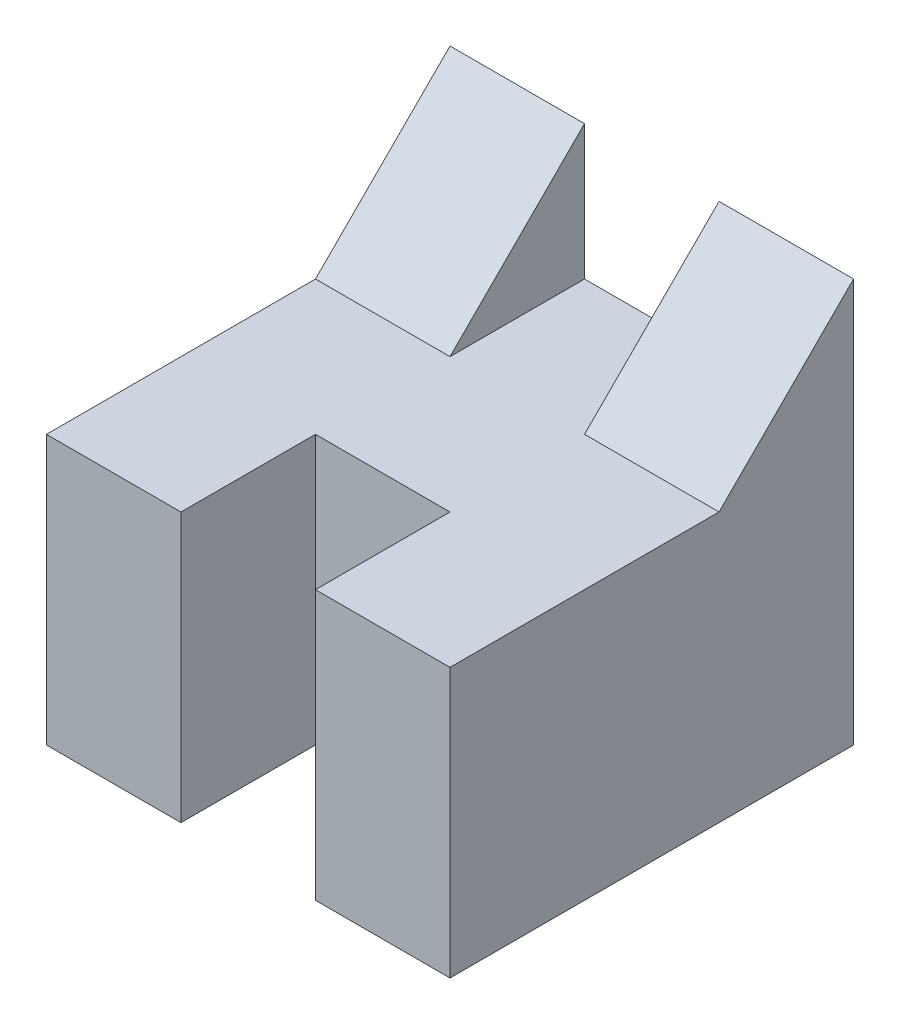
ISO-10303-21;
HEADER;
FILE_DESCRIPTION(('STEP AP214'),'2;1');
FILE_NAME('part.step','',(''),(''),'','','');
FILE_SCHEMA(('AUTOMOTIVE_DESIGN { 1 0 10303 214 1 1 1 1 }'));
ENDSEC;
DATA;
#1=APPLICATION_CONTEXT('core data for automotive mechanical design processes');
#2=APPLICATION_PROTOCOL_DEFINITION('international standard','automotive_design',2000,#1);
#3=PRODUCT_CONTEXT('',#1,'mechanical');
#4=PRODUCT('Part','Part','',(#3));
#5=PRODUCT_RELATED_PRODUCT_CATEGORY('part','',(#4));
#6=PRODUCT_DEFINITION_FORMATION('','',#4);
#7=PRODUCT_DEFINITION_CONTEXT('part definition',#1,'design');
#8=PRODUCT_DEFINITION('design','',#6,#7);
#9=PRODUCT_DEFINITION_SHAPE('','',#8);
#10=(LENGTH_UNIT() NAMED_UNIT(*) SI_UNIT(.MILLI.,.METRE.));
#11=(NAMED_UNIT(*) PLANE_ANGLE_UNIT() SI_UNIT($,.RADIAN.));
#12=(NAMED_UNIT(*) SI_UNIT($,.STERADIAN.) SOLID_ANGLE_UNIT());
#13=UNCERTAINTY_MEASURE_WITH_UNIT(LENGTH_MEASURE(1.E-05),#10,'distance_accuracy_value','');
#14=(GEOMETRIC_REPRESENTATION_CONTEXT(3) GLOBAL_UNCERTAINTY_ASSIGNED_CONTEXT((#13)) GLOBAL_UNIT_ASSIGNED_CONTEXT((#10,
#11,#12)) REPRESENTATION_CONTEXT('',''));
#15=CARTESIAN_POINT('',(0.,0.,0.));
#16=DIRECTION('',(0.,0.,1.));
#17=DIRECTION('',(1.,0.,0.));
#18=AXIS2_PLACEMENT_3D('',#15,#16,#17);
#19=CARTESIAN_POINT('',(0.,0.,0.));
#20=DIRECTION('',(0.,0.,-1.));
#21=DIRECTION('',(-1.,0.,0.));
#22=AXIS2_PLACEMENT_3D('',#19,#20,#21);
#23=PLANE('',#22);
#24=DIRECTION('',(1.,0.,0.));
#25=VECTOR('',#24,1.);
#26=CARTESIAN_POINT('',(0.,0.,0.));
#27=LINE('',#26,#25);
#28=CARTESIAN_POINT('',(0.,0.,0.));
#29=VERTEX_POINT('',#28);
#30=CARTESIAN_POINT('',(10.,0.,0.));
#31=VERTEX_POINT('',#30);
#32=EDGE_CURVE('E138',#29,#31,#27,.T.);
#33=ORIENTED_EDGE('',*,*,#32,.T.);
#34=DIRECTION('',(0.,1.,0.));
#35=VECTOR('',#34,1.);
#36=CARTESIAN_POINT('',(10.,0.,0.));
#37=LINE('',#36,#35);
#38=CARTESIAN_POINT('',(10.,20.,0.));
#39=VERTEX_POINT('',#38);
#40=EDGE_CURVE('E123',#31,#39,#37,.T.);
#41=ORIENTED_EDGE('',*,*,#40,.T.);
#42=DIRECTION('',(1.,0.,0.));
#43=VECTOR('',#42,1.);
#44=CARTESIAN_POINT('',(10.,20.,0.));
#45=LINE('',#44,#43);
#46=CARTESIAN_POINT('',(0.,20.,0.));
#47=VERTEX_POINT('',#46);
#48=EDGE_CURVE('E173',#47,#39,#45,.T.);
#49=ORIENTED_EDGE('',*,*,#48,.F.);
#50=DIRECTION('',(0.,-1.,0.));
#51=VECTOR('',#50,1.);
#52=CARTESIAN_POINT('',(0.,0.,0.));
#53=LINE('',#52,#51);
#54=EDGE_CURVE('E145',#47,#29,#53,.T.);
#55=ORIENTED_EDGE('',*,*,#54,.T.);
#56=EDGE_LOOP('',(#33,#41,#49,#55));
#57=FACE_BOUND('',#56,.T.);
#58=ADVANCED_FACE('F33',(#57),#23,.F.);
#59=CARTESIAN_POINT('',(0.,0.,-30.));
#60=DIRECTION('',(-1.,0.,0.));
#61=DIRECTION('',(0.,0.,1.));
#62=AXIS2_PLACEMENT_3D('',#59,#60,#61);
#63=PLANE('',#62);
#64=DIRECTION('',(0.,0.707106781186548,-0.707106781186548));
#65=VECTOR('',#64,1.);
#66=CARTESIAN_POINT('',(0.,0.,0.));
#67=LINE('',#66,#65);
#68=CARTESIAN_POINT('',(0.,20.,-20.));
#69=VERTEX_POINT('',#68);
#70=CARTESIAN_POINT('',(0.,30.,-30.));
#71=VERTEX_POINT('',#70);
#72=EDGE_CURVE('E198',#69,#71,#67,.T.);
#73=ORIENTED_EDGE('',*,*,#72,.T.);
#74=DIRECTION('',(0.,-1.,0.));
#75=VECTOR('',#74,1.);
#76=CARTESIAN_POINT('',(0.,0.,-30.));
#77=LINE('',#76,#75);
#78=CARTESIAN_POINT('',(0.,0.,-30.));
#79=VERTEX_POINT('',#78);
#80=EDGE_CURVE('E151',#71,#79,#77,.T.);
#81=ORIENTED_EDGE('',*,*,#80,.T.);
#82=DIRECTION('',(0.,0.,1.));
#83=VECTOR('',#82,1.);
#84=CARTESIAN_POINT('',(0.,0.,-30.));
#85=LINE('',#84,#83);
#86=EDGE_CURVE('E37',#79,#29,#85,.T.);
#87=ORIENTED_EDGE('',*,*,#86,.T.);
#88=ORIENTED_EDGE('',*,*,#54,.F.);
#89=DIRECTION('',(0.,0.,-1.));
#90=VECTOR('',#89,1.);
#91=CARTESIAN_POINT('',(0.,20.,0.));
#92=LINE('',#91,#90);
#93=EDGE_CURVE('E194',#47,#69,#92,.T.);
#94=ORIENTED_EDGE('',*,*,#93,.T.);
#95=EDGE_LOOP('',(#73,#81,#87,#88,#94));
#96=FACE_BOUND('',#95,.T.);
#97=ADVANCED_FACE('F35',(#96),#63,.T.);
#98=CARTESIAN_POINT('',(30.,0.,-30.));
#99=DIRECTION('',(1.,0.,0.));
#100=DIRECTION('',(0.,0.,-1.));
#101=AXIS2_PLACEMENT_3D('',#98,#99,#100);
#102=PLANE('',#101);
#103=DIRECTION('',(0.,0.707106781186548,-0.707106781186548));
#104=VECTOR('',#103,1.);
#105=CARTESIAN_POINT('',(30.,0.,0.));
#106=LINE('',#105,#104);
#107=CARTESIAN_POINT('',(30.,20.,-20.));
#108=VERTEX_POINT('',#107);
#109=CARTESIAN_POINT('',(30.,30.,-30.));
#110=VERTEX_POINT('',#109);
#111=EDGE_CURVE('E192',#108,#110,#106,.T.);
#112=ORIENTED_EDGE('',*,*,#111,.F.);
#113=DIRECTION('',(0.,0.,-1.));
#114=VECTOR('',#113,1.);
#115=CARTESIAN_POINT('',(30.,20.,0.));
#116=LINE('',#115,#114);
#117=CARTESIAN_POINT('',(30.,20.,0.));
#118=VERTEX_POINT('',#117);
#119=EDGE_CURVE('E195',#118,#108,#116,.T.);
#120=ORIENTED_EDGE('',*,*,#119,.F.);
#121=DIRECTION('',(0.,1.,0.));
#122=VECTOR('',#121,1.);
#123=CARTESIAN_POINT('',(30.,0.,0.));
#124=LINE('',#123,#122);
#125=CARTESIAN_POINT('',(30.,0.,0.));
#126=VERTEX_POINT('',#125);
#127=EDGE_CURVE('E147',#126,#118,#124,.T.);
#128=ORIENTED_EDGE('',*,*,#127,.F.);
#129=DIRECTION('',(0.,0.,1.));
#130=VECTOR('',#129,1.);
#131=CARTESIAN_POINT('',(30.,0.,-30.));
#132=LINE('',#131,#130);
#133=CARTESIAN_POINT('',(30.,0.,-30.));
#134=VERTEX_POINT('',#133);
#135=EDGE_CURVE('E11',#134,#126,#132,.T.);
#136=ORIENTED_EDGE('',*,*,#135,.F.);
#137=DIRECTION('',(0.,1.,0.));
#138=VECTOR('',#137,1.);
#139=CARTESIAN_POINT('',(30.,0.,-30.));
#140=LINE('',#139,#138);
#141=EDGE_CURVE('E159',#134,#110,#140,.T.);
#142=ORIENTED_EDGE('',*,*,#141,.T.);
#143=EDGE_LOOP('',(#112,#120,#128,#136,#142));
#144=FACE_BOUND('',#143,.T.);
#145=ADVANCED_FACE('F224',(#144),#102,.T.);
#146=CARTESIAN_POINT('',(0.,0.,-30.));
#147=DIRECTION('',(0.,-1.,0.));
#148=DIRECTION('',(0.,0.,-1.));
#149=AXIS2_PLACEMENT_3D('',#146,#147,#148);
#150=PLANE('',#149);
#151=DIRECTION('',(0.,0.,1.));
#152=VECTOR('',#151,1.);
#153=CARTESIAN_POINT('',(10.,0.,0.));
#154=LINE('',#153,#152);
#155=CARTESIAN_POINT('',(10.,0.,-10.));
#156=VERTEX_POINT('',#155);
#157=EDGE_CURVE('E126',#156,#31,#154,.T.);
#158=ORIENTED_EDGE('',*,*,#157,.T.);
#159=ORIENTED_EDGE('',*,*,#32,.F.);
#160=ORIENTED_EDGE('',*,*,#86,.F.);
#161=DIRECTION('',(1.,0.,0.));
#162=VECTOR('',#161,1.);
#163=CARTESIAN_POINT('',(0.,0.,-30.));
#164=LINE('',#163,#162);
#165=EDGE_CURVE('E162',#79,#134,#164,.T.);
#166=ORIENTED_EDGE('',*,*,#165,.T.);
#167=ORIENTED_EDGE('',*,*,#135,.T.);
#168=CARTESIAN_POINT('',(20.,0.,0.));
#169=VERTEX_POINT('',#168);
#170=EDGE_CURVE('E148',#169,#126,#27,.T.);
#171=ORIENTED_EDGE('',*,*,#170,.F.);
#172=DIRECTION('',(0.,0.,-1.));
#173=VECTOR('',#172,1.);
#174=CARTESIAN_POINT('',(20.,0.,0.));
#175=LINE('',#174,#173);
#176=CARTESIAN_POINT('',(20.,0.,-10.));
#177=VERTEX_POINT('',#176);
#178=EDGE_CURVE('E141',#169,#177,#175,.T.);
#179=ORIENTED_EDGE('',*,*,#178,.T.);
#180=DIRECTION('',(-1.,0.,0.));
#181=VECTOR('',#180,1.);
#182=CARTESIAN_POINT('',(10.,0.,-10.));
#183=LINE('',#182,#181);
#184=EDGE_CURVE('E133',#177,#156,#183,.T.);
#185=ORIENTED_EDGE('',*,*,#184,.T.);
#186=EDGE_LOOP('',(#158,#159,#160,#166,#167,#171,#179,#185));
#187=FACE_BOUND('',#186,.T.);
#188=ADVANCED_FACE('F137',(#187),#150,.T.);
#189=CARTESIAN_POINT('',(0.,0.,-30.));
#190=DIRECTION('',(0.,0.,-1.));
#191=DIRECTION('',(-1.,0.,0.));
#192=AXIS2_PLACEMENT_3D('',#189,#190,#191);
#193=PLANE('',#192);
#194=DIRECTION('',(0.,-1.,0.));
#195=VECTOR('',#194,1.);
#196=CARTESIAN_POINT('',(10.,30.,-30.));
#197=LINE('',#196,#195);
#198=CARTESIAN_POINT('',(10.,30.,-30.));
#199=VERTEX_POINT('',#198);
#200=CARTESIAN_POINT('',(10.,20.,-30.));
#201=VERTEX_POINT('',#200);
#202=EDGE_CURVE('E175',#199,#201,#197,.T.);
#203=ORIENTED_EDGE('',*,*,#202,.T.);
#204=DIRECTION('',(1.,0.,0.));
#205=VECTOR('',#204,1.);
#206=CARTESIAN_POINT('',(10.,20.,-30.));
#207=LINE('',#206,#205);
#208=CARTESIAN_POINT('',(20.,20.,-30.));
#209=VERTEX_POINT('',#208);
#210=EDGE_CURVE('E179',#201,#209,#207,.T.);
#211=ORIENTED_EDGE('',*,*,#210,.T.);
#212=DIRECTION('',(0.,1.,0.));
#213=VECTOR('',#212,1.);
#214=CARTESIAN_POINT('',(20.,30.,-30.));
#215=LINE('',#214,#213);
#216=CARTESIAN_POINT('',(20.,30.,-30.));
#217=VERTEX_POINT('',#216);
#218=EDGE_CURVE('E170',#209,#217,#215,.T.);
#219=ORIENTED_EDGE('',*,*,#218,.T.);
#220=DIRECTION('',(-1.,0.,0.));
#221=VECTOR('',#220,1.);
#222=CARTESIAN_POINT('',(0.,30.,-30.));
#223=LINE('',#222,#221);
#224=EDGE_CURVE('E156',#110,#217,#223,.T.);
#225=ORIENTED_EDGE('',*,*,#224,.F.);
#226=ORIENTED_EDGE('',*,*,#141,.F.);
#227=ORIENTED_EDGE('',*,*,#165,.F.);
#228=ORIENTED_EDGE('',*,*,#80,.F.);
#229=EDGE_CURVE('E158',#199,#71,#223,.T.);
#230=ORIENTED_EDGE('',*,*,#229,.F.);
#231=EDGE_LOOP('',(#203,#211,#219,#225,#226,#227,#228,#230));
#232=FACE_BOUND('',#231,.T.);
#233=ADVANCED_FACE('F236',(#232),#193,.T.);
#234=CARTESIAN_POINT('',(20.,20.,0.));
#235=VERTEX_POINT('',#234);
#236=EDGE_CURVE('E176',#235,#118,#45,.T.);
#237=ORIENTED_EDGE('',*,*,#236,.F.);
#238=DIRECTION('',(0.,1.,0.));
#239=VECTOR('',#238,1.);
#240=CARTESIAN_POINT('',(20.,0.,0.));
#241=LINE('',#240,#239);
#242=EDGE_CURVE('E48',#169,#235,#241,.T.);
#243=ORIENTED_EDGE('',*,*,#242,.F.);
#244=ORIENTED_EDGE('',*,*,#170,.T.);
#245=ORIENTED_EDGE('',*,*,#127,.T.);
#246=EDGE_LOOP('',(#237,#243,#244,#245));
#247=FACE_BOUND('',#246,.T.);
#248=ADVANCED_FACE('F217',(#247),#23,.F.);
#249=CARTESIAN_POINT('',(10.,30.,-30.));
#250=DIRECTION('',(-1.,0.,0.));
#251=DIRECTION('',(0.,-1.,0.));
#252=AXIS2_PLACEMENT_3D('',#249,#250,#251);
#253=PLANE('',#252);
#254=ORIENTED_EDGE('',*,*,#202,.F.);
#255=DIRECTION('',(0.,-0.707106781186548,0.707106781186548));
#256=VECTOR('',#255,1.);
#257=CARTESIAN_POINT('',(10.,30.,-30.));
#258=LINE('',#257,#256);
#259=CARTESIAN_POINT('',(10.,20.,-20.));
#260=VERTEX_POINT('',#259);
#261=EDGE_CURVE('E184',#199,#260,#258,.T.);
#262=ORIENTED_EDGE('',*,*,#261,.T.);
#263=DIRECTION('',(0.,0.,1.));
#264=VECTOR('',#263,1.);
#265=CARTESIAN_POINT('',(10.,20.,-30.));
#266=LINE('',#265,#264);
#267=EDGE_CURVE('E167',#201,#260,#266,.T.);
#268=ORIENTED_EDGE('',*,*,#267,.F.);
#269=EDGE_LOOP('',(#254,#262,#268));
#270=FACE_BOUND('',#269,.T.);
#271=ADVANCED_FACE('F239',(#270),#253,.F.);
#272=CARTESIAN_POINT('',(20.,30.,-30.));
#273=DIRECTION('',(1.,0.,0.));
#274=DIRECTION('',(0.,1.,0.));
#275=AXIS2_PLACEMENT_3D('',#272,#273,#274);
#276=PLANE('',#275);
#277=DIRECTION('',(0.,0.,1.));
#278=VECTOR('',#277,1.);
#279=CARTESIAN_POINT('',(20.,20.,-30.));
#280=LINE('',#279,#278);
#281=CARTESIAN_POINT('',(20.,20.,-20.));
#282=VERTEX_POINT('',#281);
#283=EDGE_CURVE('E155',#209,#282,#280,.T.);
#284=ORIENTED_EDGE('',*,*,#283,.T.);
#285=DIRECTION('',(0.,0.707106781186548,-0.707106781186548));
#286=VECTOR('',#285,1.);
#287=CARTESIAN_POINT('',(20.,30.,-30.));
#288=LINE('',#287,#286);
#289=EDGE_CURVE('E187',#282,#217,#288,.T.);
#290=ORIENTED_EDGE('',*,*,#289,.T.);
#291=ORIENTED_EDGE('',*,*,#218,.F.);
#292=EDGE_LOOP('',(#284,#290,#291));
#293=FACE_BOUND('',#292,.T.);
#294=ADVANCED_FACE('F231',(#293),#276,.F.);
#295=CARTESIAN_POINT('',(10.,20.,-30.));
#296=DIRECTION('',(0.,-1.,0.));
#297=DIRECTION('',(0.,0.,-1.));
#298=AXIS2_PLACEMENT_3D('',#295,#296,#297);
#299=PLANE('',#298);
#300=ORIENTED_EDGE('',*,*,#48,.T.);
#301=DIRECTION('',(0.,0.,1.));
#302=VECTOR('',#301,1.);
#303=CARTESIAN_POINT('',(10.,20.,0.));
#304=LINE('',#303,#302);
#305=CARTESIAN_POINT('',(10.,20.,-10.));
#306=VERTEX_POINT('',#305);
#307=EDGE_CURVE('E129',#306,#39,#304,.T.);
#308=ORIENTED_EDGE('',*,*,#307,.F.);
#309=DIRECTION('',(-1.,0.,0.));
#310=VECTOR('',#309,1.);
#311=CARTESIAN_POINT('',(10.,20.,-10.));
#312=LINE('',#311,#310);
#313=CARTESIAN_POINT('',(20.,20.,-10.));
#314=VERTEX_POINT('',#313);
#315=EDGE_CURVE('E142',#314,#306,#312,.T.);
#316=ORIENTED_EDGE('',*,*,#315,.F.);
#317=DIRECTION('',(0.,0.,-1.));
#318=VECTOR('',#317,1.);
#319=CARTESIAN_POINT('',(20.,20.,0.));
#320=LINE('',#319,#318);
#321=EDGE_CURVE('E209',#235,#314,#320,.T.);
#322=ORIENTED_EDGE('',*,*,#321,.F.);
#323=ORIENTED_EDGE('',*,*,#236,.T.);
#324=ORIENTED_EDGE('',*,*,#119,.T.);
#325=DIRECTION('',(1.,0.,0.));
#326=VECTOR('',#325,1.);
#327=CARTESIAN_POINT('',(0.,20.,-20.));
#328=LINE('',#327,#326);
#329=EDGE_CURVE('E56',#282,#108,#328,.T.);
#330=ORIENTED_EDGE('',*,*,#329,.F.);
#331=ORIENTED_EDGE('',*,*,#283,.F.);
#332=ORIENTED_EDGE('',*,*,#210,.F.);
#333=ORIENTED_EDGE('',*,*,#267,.T.);
#334=EDGE_CURVE('E190',#69,#260,#328,.T.);
#335=ORIENTED_EDGE('',*,*,#334,.F.);
#336=ORIENTED_EDGE('',*,*,#93,.F.);
#337=EDGE_LOOP('',(#300,#308,#316,#322,#323,#324,#330,#331,#332,#333,#335,#336));
#338=FACE_BOUND('',#337,.T.);
#339=ADVANCED_FACE('F220',(#338),#299,.F.);
#340=CARTESIAN_POINT('',(0.,0.,0.));
#341=DIRECTION('',(0.,-0.707106781186547,-0.707106781186547));
#342=DIRECTION('',(0.,0.707106781186548,-0.707106781186548));
#343=AXIS2_PLACEMENT_3D('',#340,#341,#342);
#344=PLANE('',#343);
#345=ORIENTED_EDGE('',*,*,#329,.T.);
#346=ORIENTED_EDGE('',*,*,#111,.T.);
#347=ORIENTED_EDGE('',*,*,#224,.T.);
#348=ORIENTED_EDGE('',*,*,#289,.F.);
#349=EDGE_LOOP('',(#345,#346,#347,#348));
#350=FACE_BOUND('',#349,.T.);
#351=ADVANCED_FACE('F228',(#350),#344,.F.);
#352=ORIENTED_EDGE('',*,*,#229,.T.);
#353=ORIENTED_EDGE('',*,*,#72,.F.);
#354=ORIENTED_EDGE('',*,*,#334,.T.);
#355=ORIENTED_EDGE('',*,*,#261,.F.);
#356=EDGE_LOOP('',(#352,#353,#354,#355));
#357=FACE_BOUND('',#356,.T.);
#358=ADVANCED_FACE('F241',(#357),#344,.F.);
#359=CARTESIAN_POINT('',(10.,0.,0.));
#360=DIRECTION('',(-1.,0.,0.));
#361=DIRECTION('',(0.,0.,1.));
#362=AXIS2_PLACEMENT_3D('',#359,#360,#361);
#363=PLANE('',#362);
#364=ORIENTED_EDGE('',*,*,#307,.T.);
#365=ORIENTED_EDGE('',*,*,#40,.F.);
#366=ORIENTED_EDGE('',*,*,#157,.F.);
#367=DIRECTION('',(0.,1.,0.));
#368=VECTOR('',#367,1.);
#369=CARTESIAN_POINT('',(10.,0.,-10.));
#370=LINE('',#369,#368);
#371=EDGE_CURVE('E197',#156,#306,#370,.T.);
#372=ORIENTED_EDGE('',*,*,#371,.T.);
#373=EDGE_LOOP('',(#364,#365,#366,#372));
#374=FACE_BOUND('',#373,.T.);
#375=ADVANCED_FACE('F125',(#374),#363,.F.);
#376=CARTESIAN_POINT('',(10.,0.,-10.));
#377=DIRECTION('',(0.,0.,-1.));
#378=DIRECTION('',(-1.,0.,0.));
#379=AXIS2_PLACEMENT_3D('',#376,#377,#378);
#380=PLANE('',#379);
#381=ORIENTED_EDGE('',*,*,#315,.T.);
#382=ORIENTED_EDGE('',*,*,#371,.F.);
#383=ORIENTED_EDGE('',*,*,#184,.F.);
#384=DIRECTION('',(0.,1.,0.));
#385=VECTOR('',#384,1.);
#386=CARTESIAN_POINT('',(20.,0.,-10.));
#387=LINE('',#386,#385);
#388=EDGE_CURVE('E204',#177,#314,#387,.T.);
#389=ORIENTED_EDGE('',*,*,#388,.T.);
#390=EDGE_LOOP('',(#381,#382,#383,#389));
#391=FACE_BOUND('',#390,.T.);
#392=ADVANCED_FACE('F274',(#391),#380,.F.);
#393=CARTESIAN_POINT('',(20.,0.,0.));
#394=DIRECTION('',(1.,0.,0.));
#395=DIRECTION('',(0.,0.,-1.));
#396=AXIS2_PLACEMENT_3D('',#393,#394,#395);
#397=PLANE('',#396);
#398=ORIENTED_EDGE('',*,*,#321,.T.);
#399=ORIENTED_EDGE('',*,*,#388,.F.);
#400=ORIENTED_EDGE('',*,*,#178,.F.);
#401=ORIENTED_EDGE('',*,*,#242,.T.);
#402=EDGE_LOOP('',(#398,#399,#400,#401));
#403=FACE_BOUND('',#402,.T.);
#404=ADVANCED_FACE('F214',(#403),#397,.F.);
#405=CLOSED_SHELL('',(#58,#97,#145,#188,#233,#248,#271,#294,#339,#351,#358,#375,#392,#404));
#406=MANIFOLD_SOLID_BREP('B2',#405);
#407=ADVANCED_BREP_SHAPE_REPRESENTATION('',(#18,#406),#14);
#408=SHAPE_DEFINITION_REPRESENTATION(#9,#407);
ENDSEC;
END-ISO-10303-21;
